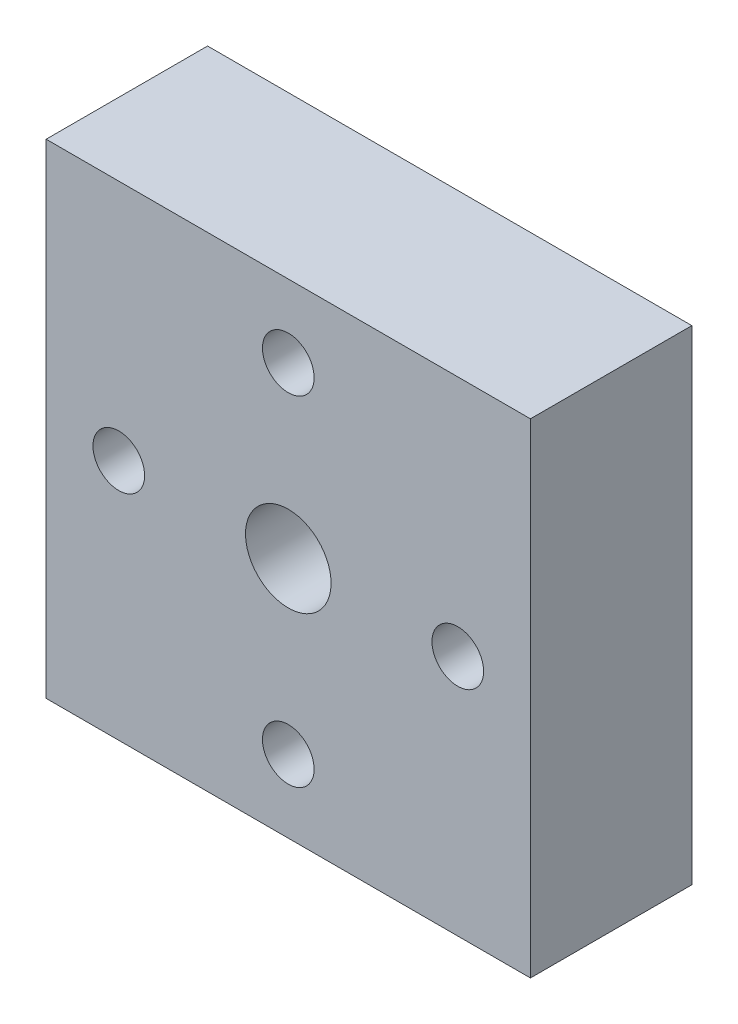
ISO-10303-21;
HEADER;
FILE_DESCRIPTION(('STEP AP214'),'2;1');
FILE_NAME('part.step','',(''),(''),'','','');
FILE_SCHEMA(('AUTOMOTIVE_DESIGN { 1 0 10303 214 1 1 1 1 }'));
ENDSEC;
DATA;
#1=APPLICATION_CONTEXT('core data for automotive mechanical design processes');
#2=APPLICATION_PROTOCOL_DEFINITION('international standard','automotive_design',2000,#1);
#3=PRODUCT_CONTEXT('',#1,'mechanical');
#4=PRODUCT('Part','Part','',(#3));
#5=PRODUCT_RELATED_PRODUCT_CATEGORY('part','',(#4));
#6=PRODUCT_DEFINITION_FORMATION('','',#4);
#7=PRODUCT_DEFINITION_CONTEXT('part definition',#1,'design');
#8=PRODUCT_DEFINITION('design','',#6,#7);
#9=PRODUCT_DEFINITION_SHAPE('','',#8);
#10=(LENGTH_UNIT() NAMED_UNIT(*) SI_UNIT(.MILLI.,.METRE.));
#11=(NAMED_UNIT(*) PLANE_ANGLE_UNIT() SI_UNIT($,.RADIAN.));
#12=(NAMED_UNIT(*) SI_UNIT($,.STERADIAN.) SOLID_ANGLE_UNIT());
#13=UNCERTAINTY_MEASURE_WITH_UNIT(LENGTH_MEASURE(1.E-05),#10,'distance_accuracy_value','');
#14=(GEOMETRIC_REPRESENTATION_CONTEXT(3) GLOBAL_UNCERTAINTY_ASSIGNED_CONTEXT((#13)) GLOBAL_UNIT_ASSIGNED_CONTEXT((#10,
#11,#12)) REPRESENTATION_CONTEXT('',''));
#15=CARTESIAN_POINT('',(0.,0.,0.));
#16=DIRECTION('',(0.,0.,1.));
#17=DIRECTION('',(1.,0.,0.));
#18=AXIS2_PLACEMENT_3D('',#15,#16,#17);
#19=CARTESIAN_POINT('',(30.,15.,-15.));
#20=DIRECTION('',(0.,0.,1.));
#21=DIRECTION('',(0.,-1.,0.));
#22=AXIS2_PLACEMENT_3D('',#19,#20,#21);
#23=PLANE('',#22);
#24=CARTESIAN_POINT('',(15.,10.5,-15.));
#25=DIRECTION('',(0.,0.,-1.));
#26=DIRECTION('',(0.,1.,0.));
#27=AXIS2_PLACEMENT_3D('',#24,#25,#26);
#28=CIRCLE('',#27,3.);
#29=CARTESIAN_POINT('',(15.,13.5,-15.));
#30=VERTEX_POINT('',#29);
#31=EDGE_CURVE('E237',#30,#30,#28,.T.);
#32=ORIENTED_EDGE('',*,*,#31,.F.);
#33=EDGE_LOOP('',(#32));
#34=FACE_BOUND('',#33,.T.);
#35=CARTESIAN_POINT('',(15.,-10.5,-15.));
#36=DIRECTION('',(0.,0.,-1.));
#37=DIRECTION('',(0.,1.,0.));
#38=AXIS2_PLACEMENT_3D('',#35,#36,#37);
#39=CIRCLE('',#38,3.);
#40=CARTESIAN_POINT('',(15.,-7.5,-15.));
#41=VERTEX_POINT('',#40);
#42=EDGE_CURVE('E233',#41,#41,#39,.T.);
#43=ORIENTED_EDGE('',*,*,#42,.F.);
#44=EDGE_LOOP('',(#43));
#45=FACE_BOUND('',#44,.T.);
#46=CARTESIAN_POINT('',(25.5,0.,-15.));
#47=DIRECTION('',(0.,0.,-1.));
#48=DIRECTION('',(0.,1.,0.));
#49=AXIS2_PLACEMENT_3D('',#46,#47,#48);
#50=CIRCLE('',#49,2.99999999999999);
#51=CARTESIAN_POINT('',(25.5,3.,-15.));
#52=VERTEX_POINT('',#51);
#53=EDGE_CURVE('E225',#52,#52,#50,.T.);
#54=ORIENTED_EDGE('',*,*,#53,.F.);
#55=EDGE_LOOP('',(#54));
#56=FACE_BOUND('',#55,.T.);
#57=CARTESIAN_POINT('',(4.5,0.,-15.));
#58=DIRECTION('',(0.,0.,-1.));
#59=DIRECTION('',(0.,1.,0.));
#60=AXIS2_PLACEMENT_3D('',#57,#58,#59);
#61=CIRCLE('',#60,3.);
#62=CARTESIAN_POINT('',(4.5,3.,-15.));
#63=VERTEX_POINT('',#62);
#64=EDGE_CURVE('E216',#63,#63,#61,.T.);
#65=ORIENTED_EDGE('',*,*,#64,.F.);
#66=EDGE_LOOP('',(#65));
#67=FACE_BOUND('',#66,.T.);
#68=CARTESIAN_POINT('',(15.,0.,-15.));
#69=DIRECTION('',(0.,0.,-1.));
#70=DIRECTION('',(0.,1.,0.));
#71=AXIS2_PLACEMENT_3D('',#68,#69,#70);
#72=CIRCLE('',#71,3.2);
#73=CARTESIAN_POINT('',(15.,3.2,-15.));
#74=VERTEX_POINT('',#73);
#75=EDGE_CURVE('E133',#74,#74,#72,.T.);
#76=ORIENTED_EDGE('',*,*,#75,.F.);
#77=EDGE_LOOP('',(#76));
#78=FACE_BOUND('',#77,.T.);
#79=CARTESIAN_POINT('',(6.16,-8.84,-15.));
#80=DIRECTION('',(0.,0.,1.));
#81=DIRECTION('',(0.,-1.,0.));
#82=AXIS2_PLACEMENT_3D('',#79,#80,#81);
#83=CIRCLE('',#82,1.95);
#84=CARTESIAN_POINT('',(6.16,-10.79,-15.));
#85=VERTEX_POINT('',#84);
#86=EDGE_CURVE('E11',#85,#85,#83,.F.);
#87=ORIENTED_EDGE('',*,*,#86,.F.);
#88=EDGE_LOOP('',(#87));
#89=FACE_BOUND('',#88,.T.);
#90=CARTESIAN_POINT('',(23.84,-8.84,-15.));
#91=DIRECTION('',(0.,0.,1.));
#92=DIRECTION('',(0.,-1.,0.));
#93=AXIS2_PLACEMENT_3D('',#90,#91,#92);
#94=CIRCLE('',#93,1.95);
#95=CARTESIAN_POINT('',(23.84,-10.79,-15.));
#96=VERTEX_POINT('',#95);
#97=EDGE_CURVE('E52',#96,#96,#94,.F.);
#98=ORIENTED_EDGE('',*,*,#97,.F.);
#99=EDGE_LOOP('',(#98));
#100=FACE_BOUND('',#99,.T.);
#101=CARTESIAN_POINT('',(23.84,8.84,-15.));
#102=DIRECTION('',(0.,0.,1.));
#103=DIRECTION('',(0.,-1.,0.));
#104=AXIS2_PLACEMENT_3D('',#101,#102,#103);
#105=CIRCLE('',#104,1.95);
#106=CARTESIAN_POINT('',(23.84,6.89,-15.));
#107=VERTEX_POINT('',#106);
#108=EDGE_CURVE('E124',#107,#107,#105,.F.);
#109=ORIENTED_EDGE('',*,*,#108,.F.);
#110=EDGE_LOOP('',(#109));
#111=FACE_BOUND('',#110,.T.);
#112=CARTESIAN_POINT('',(6.16,8.84,-15.));
#113=DIRECTION('',(0.,0.,1.));
#114=DIRECTION('',(0.,-1.,0.));
#115=AXIS2_PLACEMENT_3D('',#112,#113,#114);
#116=CIRCLE('',#115,1.95);
#117=CARTESIAN_POINT('',(6.16,6.89,-15.));
#118=VERTEX_POINT('',#117);
#119=EDGE_CURVE('E120',#118,#118,#116,.F.);
#120=ORIENTED_EDGE('',*,*,#119,.F.);
#121=EDGE_LOOP('',(#120));
#122=FACE_BOUND('',#121,.T.);
#123=CARTESIAN_POINT('',(15.,6.00010191410672,-15.));
#124=DIRECTION('',(0.,0.,-1.));
#125=DIRECTION('',(0.,1.,0.));
#126=AXIS2_PLACEMENT_3D('',#123,#124,#125);
#127=CIRCLE('',#126,0.649999999999999);
#128=CARTESIAN_POINT('',(15.,6.65010191410671,-15.));
#129=VERTEX_POINT('',#128);
#130=EDGE_CURVE('E113',#129,#129,#127,.T.);
#131=ORIENTED_EDGE('',*,*,#130,.F.);
#132=EDGE_LOOP('',(#131));
#133=FACE_BOUND('',#132,.T.);
#134=CARTESIAN_POINT('',(21.0010031212094,0.00299776167001203,-15.));
#135=DIRECTION('',(0.,0.,-1.));
#136=DIRECTION('',(0.,1.,0.));
#137=AXIS2_PLACEMENT_3D('',#134,#135,#136);
#138=CIRCLE('',#137,0.650000000000001);
#139=CARTESIAN_POINT('',(21.0010031212094,0.652997761670013,-15.));
#140=VERTEX_POINT('',#139);
#141=EDGE_CURVE('E170',#140,#140,#138,.T.);
#142=ORIENTED_EDGE('',*,*,#141,.F.);
#143=EDGE_LOOP('',(#142));
#144=FACE_BOUND('',#143,.T.);
#145=CARTESIAN_POINT('',(8.99732425437229,0.00299776167001116,-15.));
#146=DIRECTION('',(0.,0.,-1.));
#147=DIRECTION('',(0.,1.,0.));
#148=AXIS2_PLACEMENT_3D('',#145,#146,#147);
#149=CIRCLE('',#148,0.649999999999999);
#150=CARTESIAN_POINT('',(8.99732425437229,0.65299776167001,-15.));
#151=VERTEX_POINT('',#150);
#152=EDGE_CURVE('E178',#151,#151,#149,.T.);
#153=ORIENTED_EDGE('',*,*,#152,.F.);
#154=EDGE_LOOP('',(#153));
#155=FACE_BOUND('',#154,.T.);
#156=CARTESIAN_POINT('',(15.,-6.00010191410671,-15.));
#157=DIRECTION('',(0.,0.,-1.));
#158=DIRECTION('',(0.,1.,0.));
#159=AXIS2_PLACEMENT_3D('',#156,#157,#158);
#160=CIRCLE('',#159,0.649999999999999);
#161=CARTESIAN_POINT('',(15.,-5.35010191410672,-15.));
#162=VERTEX_POINT('',#161);
#163=EDGE_CURVE('E186',#162,#162,#160,.T.);
#164=ORIENTED_EDGE('',*,*,#163,.F.);
#165=EDGE_LOOP('',(#164));
#166=FACE_BOUND('',#165,.T.);
#167=DIRECTION('',(0.,1.,0.));
#168=VECTOR('',#167,1.);
#169=CARTESIAN_POINT('',(0.,15.,-15.));
#170=LINE('',#169,#168);
#171=CARTESIAN_POINT('',(0.,-15.,-15.));
#172=VERTEX_POINT('',#171);
#173=CARTESIAN_POINT('',(0.,15.,-15.));
#174=VERTEX_POINT('',#173);
#175=EDGE_CURVE('E99',#172,#174,#170,.T.);
#176=ORIENTED_EDGE('',*,*,#175,.T.);
#177=DIRECTION('',(-1.,0.,0.));
#178=VECTOR('',#177,1.);
#179=CARTESIAN_POINT('',(30.,15.,-15.));
#180=LINE('',#179,#178);
#181=CARTESIAN_POINT('',(30.,15.,-15.));
#182=VERTEX_POINT('',#181);
#183=EDGE_CURVE('E101',#182,#174,#180,.T.);
#184=ORIENTED_EDGE('',*,*,#183,.F.);
#185=DIRECTION('',(0.,1.,0.));
#186=VECTOR('',#185,1.);
#187=CARTESIAN_POINT('',(30.,15.,-15.));
#188=LINE('',#187,#186);
#189=CARTESIAN_POINT('',(30.,-15.,-15.));
#190=VERTEX_POINT('',#189);
#191=EDGE_CURVE('E93',#190,#182,#188,.T.);
#192=ORIENTED_EDGE('',*,*,#191,.F.);
#193=DIRECTION('',(-1.,0.,0.));
#194=VECTOR('',#193,1.);
#195=CARTESIAN_POINT('',(30.,-15.,-15.));
#196=LINE('',#195,#194);
#197=EDGE_CURVE('E86',#190,#172,#196,.T.);
#198=ORIENTED_EDGE('',*,*,#197,.T.);
#199=EDGE_LOOP('',(#176,#184,#192,#198));
#200=FACE_BOUND('',#199,.T.);
#201=ADVANCED_FACE('F43',(#34,#45,#56,#67,#78,#89,#100,#111,#122,#133,#144,#155,#166,#200),#23,.F.);
#202=CARTESIAN_POINT('',(30.,15.,15.));
#203=DIRECTION('',(0.,-1.,0.));
#204=DIRECTION('',(0.,0.,-1.));
#205=AXIS2_PLACEMENT_3D('',#202,#203,#204);
#206=PLANE('',#205);
#207=DIRECTION('',(0.,0.,1.));
#208=VECTOR('',#207,1.);
#209=CARTESIAN_POINT('',(0.,15.,15.));
#210=LINE('',#209,#208);
#211=CARTESIAN_POINT('',(0.,15.,-5.));
#212=VERTEX_POINT('',#211);
#213=EDGE_CURVE('E94',#174,#212,#210,.T.);
#214=ORIENTED_EDGE('',*,*,#213,.T.);
#215=DIRECTION('',(1.,0.,0.));
#216=VECTOR('',#215,1.);
#217=CARTESIAN_POINT('',(0.,15.,-5.));
#218=LINE('',#217,#216);
#219=CARTESIAN_POINT('',(30.,15.,-5.));
#220=VERTEX_POINT('',#219);
#221=EDGE_CURVE('E60',#212,#220,#218,.T.);
#222=ORIENTED_EDGE('',*,*,#221,.T.);
#223=DIRECTION('',(0.,0.,1.));
#224=VECTOR('',#223,1.);
#225=CARTESIAN_POINT('',(30.,15.,15.));
#226=LINE('',#225,#224);
#227=EDGE_CURVE('E194',#182,#220,#226,.T.);
#228=ORIENTED_EDGE('',*,*,#227,.F.);
#229=ORIENTED_EDGE('',*,*,#183,.T.);
#230=EDGE_LOOP('',(#214,#222,#228,#229));
#231=FACE_BOUND('',#230,.T.);
#232=ADVANCED_FACE('F204',(#231),#206,.F.);
#233=CARTESIAN_POINT('',(30.,-15.,15.));
#234=DIRECTION('',(0.,1.,0.));
#235=DIRECTION('',(0.,0.,1.));
#236=AXIS2_PLACEMENT_3D('',#233,#234,#235);
#237=PLANE('',#236);
#238=DIRECTION('',(0.,0.,-1.));
#239=VECTOR('',#238,1.);
#240=CARTESIAN_POINT('',(30.,-15.,15.));
#241=LINE('',#240,#239);
#242=CARTESIAN_POINT('',(30.,-15.,-5.00000000000001));
#243=VERTEX_POINT('',#242);
#244=EDGE_CURVE('E69',#243,#190,#241,.T.);
#245=ORIENTED_EDGE('',*,*,#244,.F.);
#246=DIRECTION('',(-1.,0.,0.));
#247=VECTOR('',#246,1.);
#248=CARTESIAN_POINT('',(30.,-15.,-5.));
#249=LINE('',#248,#247);
#250=CARTESIAN_POINT('',(0.,-15.,-5.00000000000001));
#251=VERTEX_POINT('',#250);
#252=EDGE_CURVE('E89',#243,#251,#249,.T.);
#253=ORIENTED_EDGE('',*,*,#252,.T.);
#254=DIRECTION('',(0.,0.,-1.));
#255=VECTOR('',#254,1.);
#256=CARTESIAN_POINT('',(0.,-15.,15.));
#257=LINE('',#256,#255);
#258=EDGE_CURVE('E83',#251,#172,#257,.T.);
#259=ORIENTED_EDGE('',*,*,#258,.T.);
#260=ORIENTED_EDGE('',*,*,#197,.F.);
#261=EDGE_LOOP('',(#245,#253,#259,#260));
#262=FACE_BOUND('',#261,.T.);
#263=ADVANCED_FACE('F85',(#262),#237,.F.);
#264=CARTESIAN_POINT('',(30.,0.,0.));
#265=DIRECTION('',(1.,0.,0.));
#266=DIRECTION('',(0.,0.,-1.));
#267=AXIS2_PLACEMENT_3D('',#264,#265,#266);
#268=PLANE('',#267);
#269=DIRECTION('',(0.,1.,0.));
#270=VECTOR('',#269,1.);
#271=CARTESIAN_POINT('',(30.,15.,-5.));
#272=LINE('',#271,#270);
#273=EDGE_CURVE('E201',#243,#220,#272,.T.);
#274=ORIENTED_EDGE('',*,*,#273,.F.);
#275=ORIENTED_EDGE('',*,*,#244,.T.);
#276=ORIENTED_EDGE('',*,*,#191,.T.);
#277=ORIENTED_EDGE('',*,*,#227,.T.);
#278=EDGE_LOOP('',(#274,#275,#276,#277));
#279=FACE_BOUND('',#278,.T.);
#280=ADVANCED_FACE('F199',(#279),#268,.T.);
#281=CARTESIAN_POINT('',(0.,0.,0.));
#282=DIRECTION('',(1.,0.,0.));
#283=DIRECTION('',(0.,0.,-1.));
#284=AXIS2_PLACEMENT_3D('',#281,#282,#283);
#285=PLANE('',#284);
#286=ORIENTED_EDGE('',*,*,#258,.F.);
#287=DIRECTION('',(0.,1.,0.));
#288=VECTOR('',#287,1.);
#289=CARTESIAN_POINT('',(0.,15.,-5.));
#290=LINE('',#289,#288);
#291=EDGE_CURVE('E206',#251,#212,#290,.T.);
#292=ORIENTED_EDGE('',*,*,#291,.T.);
#293=ORIENTED_EDGE('',*,*,#213,.F.);
#294=ORIENTED_EDGE('',*,*,#175,.F.);
#295=EDGE_LOOP('',(#286,#292,#293,#294));
#296=FACE_BOUND('',#295,.T.);
#297=ADVANCED_FACE('F103',(#296),#285,.F.);
#298=CARTESIAN_POINT('',(15.,-6.00010191410671,-8.));
#299=DIRECTION('',(0.,0.,-1.));
#300=DIRECTION('',(0.,1.,0.));
#301=AXIS2_PLACEMENT_3D('',#298,#299,#300);
#302=CYLINDRICAL_SURFACE('',#301,0.649999999999999);
#303=CARTESIAN_POINT('',(15.,-6.00010191410671,-8.));
#304=DIRECTION('',(0.,0.,-1.));
#305=DIRECTION('',(0.,1.,0.));
#306=AXIS2_PLACEMENT_3D('',#303,#304,#305);
#307=CIRCLE('',#306,0.649999999999999);
#308=CARTESIAN_POINT('',(15.,-5.35010191410672,-8.));
#309=VERTEX_POINT('',#308);
#310=EDGE_CURVE('E165',#309,#309,#307,.T.);
#311=ORIENTED_EDGE('',*,*,#310,.F.);
#312=EDGE_LOOP('',(#311));
#313=FACE_BOUND('',#312,.T.);
#314=ORIENTED_EDGE('',*,*,#163,.T.);
#315=EDGE_LOOP('',(#314));
#316=FACE_BOUND('',#315,.T.);
#317=ADVANCED_FACE('F320',(#313,#316),#302,.F.);
#318=CARTESIAN_POINT('',(15.,-6.00010191410671,-8.));
#319=DIRECTION('',(0.,0.,-1.));
#320=DIRECTION('',(0.,1.,0.));
#321=AXIS2_PLACEMENT_3D('',#318,#319,#320);
#322=PLANE('',#321);
#323=ORIENTED_EDGE('',*,*,#310,.T.);
#324=EDGE_LOOP('',(#323));
#325=FACE_BOUND('',#324,.T.);
#326=ADVANCED_FACE('F322',(#325),#322,.T.);
#327=CARTESIAN_POINT('',(8.99732425437229,0.00299776167001027,-8.));
#328=DIRECTION('',(0.,0.,-1.));
#329=DIRECTION('',(0.,1.,0.));
#330=AXIS2_PLACEMENT_3D('',#327,#328,#329);
#331=CYLINDRICAL_SURFACE('',#330,0.649999999999999);
#332=CARTESIAN_POINT('',(8.99732425437229,0.00299776167001027,-8.));
#333=DIRECTION('',(0.,0.,-1.));
#334=DIRECTION('',(0.,1.,0.));
#335=AXIS2_PLACEMENT_3D('',#332,#333,#334);
#336=CIRCLE('',#335,0.649999999999999);
#337=CARTESIAN_POINT('',(8.99732425437229,0.652997761670009,-8.));
#338=VERTEX_POINT('',#337);
#339=EDGE_CURVE('E182',#338,#338,#336,.T.);
#340=ORIENTED_EDGE('',*,*,#339,.F.);
#341=EDGE_LOOP('',(#340));
#342=FACE_BOUND('',#341,.T.);
#343=ORIENTED_EDGE('',*,*,#152,.T.);
#344=EDGE_LOOP('',(#343));
#345=FACE_BOUND('',#344,.T.);
#346=ADVANCED_FACE('F329',(#342,#345),#331,.F.);
#347=CARTESIAN_POINT('',(8.99732425437229,0.00299776167001027,-8.));
#348=DIRECTION('',(0.,0.,-1.));
#349=DIRECTION('',(0.,1.,0.));
#350=AXIS2_PLACEMENT_3D('',#347,#348,#349);
#351=PLANE('',#350);
#352=ORIENTED_EDGE('',*,*,#339,.T.);
#353=EDGE_LOOP('',(#352));
#354=FACE_BOUND('',#353,.T.);
#355=ADVANCED_FACE('F335',(#354),#351,.T.);
#356=CARTESIAN_POINT('',(21.0010031212094,0.00299776167001114,-8.));
#357=DIRECTION('',(0.,0.,-1.));
#358=DIRECTION('',(0.,1.,0.));
#359=AXIS2_PLACEMENT_3D('',#356,#357,#358);
#360=CYLINDRICAL_SURFACE('',#359,0.650000000000001);
#361=CARTESIAN_POINT('',(21.0010031212094,0.00299776167001114,-8.));
#362=DIRECTION('',(0.,0.,-1.));
#363=DIRECTION('',(0.,1.,0.));
#364=AXIS2_PLACEMENT_3D('',#361,#362,#363);
#365=CIRCLE('',#364,0.650000000000001);
#366=CARTESIAN_POINT('',(21.0010031212094,0.652997761670012,-8.));
#367=VERTEX_POINT('',#366);
#368=EDGE_CURVE('E174',#367,#367,#365,.T.);
#369=ORIENTED_EDGE('',*,*,#368,.F.);
#370=EDGE_LOOP('',(#369));
#371=FACE_BOUND('',#370,.T.);
#372=ORIENTED_EDGE('',*,*,#141,.T.);
#373=EDGE_LOOP('',(#372));
#374=FACE_BOUND('',#373,.T.);
#375=ADVANCED_FACE('F647',(#371,#374),#360,.F.);
#376=CARTESIAN_POINT('',(21.0010031212094,0.00299776167001114,-8.));
#377=DIRECTION('',(0.,0.,-1.));
#378=DIRECTION('',(0.,1.,0.));
#379=AXIS2_PLACEMENT_3D('',#376,#377,#378);
#380=PLANE('',#379);
#381=ORIENTED_EDGE('',*,*,#368,.T.);
#382=EDGE_LOOP('',(#381));
#383=FACE_BOUND('',#382,.T.);
#384=ADVANCED_FACE('F637',(#383),#380,.T.);
#385=CARTESIAN_POINT('',(15.,6.00010191410671,-8.));
#386=DIRECTION('',(0.,0.,-1.));
#387=DIRECTION('',(0.,1.,0.));
#388=AXIS2_PLACEMENT_3D('',#385,#386,#387);
#389=CYLINDRICAL_SURFACE('',#388,0.649999999999999);
#390=CARTESIAN_POINT('',(15.,6.00010191410671,-8.));
#391=DIRECTION('',(0.,0.,-1.));
#392=DIRECTION('',(0.,1.,0.));
#393=AXIS2_PLACEMENT_3D('',#390,#391,#392);
#394=CIRCLE('',#393,0.649999999999999);
#395=CARTESIAN_POINT('',(15.,6.65010191410671,-8.));
#396=VERTEX_POINT('',#395);
#397=EDGE_CURVE('E107',#396,#396,#394,.T.);
#398=ORIENTED_EDGE('',*,*,#397,.F.);
#399=EDGE_LOOP('',(#398));
#400=FACE_BOUND('',#399,.T.);
#401=ORIENTED_EDGE('',*,*,#130,.T.);
#402=EDGE_LOOP('',(#401));
#403=FACE_BOUND('',#402,.T.);
#404=ADVANCED_FACE('F627',(#400,#403),#389,.F.);
#405=CARTESIAN_POINT('',(15.,6.00010191410671,-8.));
#406=DIRECTION('',(0.,0.,-1.));
#407=DIRECTION('',(0.,1.,0.));
#408=AXIS2_PLACEMENT_3D('',#405,#406,#407);
#409=PLANE('',#408);
#410=ORIENTED_EDGE('',*,*,#397,.T.);
#411=EDGE_LOOP('',(#410));
#412=FACE_BOUND('',#411,.T.);
#413=ADVANCED_FACE('F617',(#412),#409,.T.);
#414=CARTESIAN_POINT('',(6.16,8.84,-17.));
#415=DIRECTION('',(0.,0.,1.));
#416=DIRECTION('',(0.,-1.,0.));
#417=AXIS2_PLACEMENT_3D('',#414,#415,#416);
#418=CYLINDRICAL_SURFACE('',#417,1.95);
#419=CARTESIAN_POINT('',(6.16,8.84,-17.));
#420=DIRECTION('',(0.,0.,-1.));
#421=DIRECTION('',(0.,1.,0.));
#422=AXIS2_PLACEMENT_3D('',#419,#420,#421);
#423=CIRCLE('',#422,1.95);
#424=CARTESIAN_POINT('',(6.16,10.79,-17.));
#425=VERTEX_POINT('',#424);
#426=EDGE_CURVE('E162',#425,#425,#423,.T.);
#427=ORIENTED_EDGE('',*,*,#426,.F.);
#428=EDGE_LOOP('',(#427));
#429=FACE_BOUND('',#428,.T.);
#430=ORIENTED_EDGE('',*,*,#119,.T.);
#431=EDGE_LOOP('',(#430));
#432=FACE_BOUND('',#431,.T.);
#433=ADVANCED_FACE('F607',(#429,#432),#418,.T.);
#434=CARTESIAN_POINT('',(6.16,8.84,-17.));
#435=DIRECTION('',(0.,0.,-1.));
#436=DIRECTION('',(0.,1.,0.));
#437=AXIS2_PLACEMENT_3D('',#434,#435,#436);
#438=PLANE('',#437);
#439=ORIENTED_EDGE('',*,*,#426,.T.);
#440=EDGE_LOOP('',(#439));
#441=FACE_BOUND('',#440,.T.);
#442=ADVANCED_FACE('F597',(#441),#438,.T.);
#443=CARTESIAN_POINT('',(23.84,8.84,-17.));
#444=DIRECTION('',(0.,0.,1.));
#445=DIRECTION('',(0.,-1.,0.));
#446=AXIS2_PLACEMENT_3D('',#443,#444,#445);
#447=CYLINDRICAL_SURFACE('',#446,1.95);
#448=CARTESIAN_POINT('',(23.84,8.84,-17.));
#449=DIRECTION('',(0.,0.,-1.));
#450=DIRECTION('',(0.,1.,0.));
#451=AXIS2_PLACEMENT_3D('',#448,#449,#450);
#452=CIRCLE('',#451,1.95);
#453=CARTESIAN_POINT('',(23.84,10.79,-17.));
#454=VERTEX_POINT('',#453);
#455=EDGE_CURVE('E158',#454,#454,#452,.T.);
#456=ORIENTED_EDGE('',*,*,#455,.F.);
#457=EDGE_LOOP('',(#456));
#458=FACE_BOUND('',#457,.T.);
#459=ORIENTED_EDGE('',*,*,#108,.T.);
#460=EDGE_LOOP('',(#459));
#461=FACE_BOUND('',#460,.T.);
#462=ADVANCED_FACE('F587',(#458,#461),#447,.T.);
#463=CARTESIAN_POINT('',(23.84,8.84,-17.));
#464=DIRECTION('',(0.,0.,-1.));
#465=DIRECTION('',(0.,1.,0.));
#466=AXIS2_PLACEMENT_3D('',#463,#464,#465);
#467=PLANE('',#466);
#468=ORIENTED_EDGE('',*,*,#455,.T.);
#469=EDGE_LOOP('',(#468));
#470=FACE_BOUND('',#469,.T.);
#471=ADVANCED_FACE('F577',(#470),#467,.T.);
#472=CARTESIAN_POINT('',(23.84,-8.84,-17.));
#473=DIRECTION('',(0.,0.,1.));
#474=DIRECTION('',(0.,-1.,0.));
#475=AXIS2_PLACEMENT_3D('',#472,#473,#474);
#476=CYLINDRICAL_SURFACE('',#475,1.95);
#477=CARTESIAN_POINT('',(23.84,-8.84,-17.));
#478=DIRECTION('',(0.,0.,-1.));
#479=DIRECTION('',(0.,1.,0.));
#480=AXIS2_PLACEMENT_3D('',#477,#478,#479);
#481=CIRCLE('',#480,1.95);
#482=CARTESIAN_POINT('',(23.84,-6.89,-17.));
#483=VERTEX_POINT('',#482);
#484=EDGE_CURVE('E154',#483,#483,#481,.T.);
#485=ORIENTED_EDGE('',*,*,#484,.F.);
#486=EDGE_LOOP('',(#485));
#487=FACE_BOUND('',#486,.T.);
#488=ORIENTED_EDGE('',*,*,#97,.T.);
#489=EDGE_LOOP('',(#488));
#490=FACE_BOUND('',#489,.T.);
#491=ADVANCED_FACE('F567',(#487,#490),#476,.T.);
#492=CARTESIAN_POINT('',(23.84,-8.84,-17.));
#493=DIRECTION('',(0.,0.,-1.));
#494=DIRECTION('',(0.,1.,0.));
#495=AXIS2_PLACEMENT_3D('',#492,#493,#494);
#496=PLANE('',#495);
#497=ORIENTED_EDGE('',*,*,#484,.T.);
#498=EDGE_LOOP('',(#497));
#499=FACE_BOUND('',#498,.T.);
#500=ADVANCED_FACE('F557',(#499),#496,.T.);
#501=CARTESIAN_POINT('',(6.16,-8.84,-17.));
#502=DIRECTION('',(0.,0.,1.));
#503=DIRECTION('',(0.,-1.,0.));
#504=AXIS2_PLACEMENT_3D('',#501,#502,#503);
#505=CYLINDRICAL_SURFACE('',#504,1.95);
#506=CARTESIAN_POINT('',(6.16,-8.84,-17.));
#507=DIRECTION('',(0.,0.,-1.));
#508=DIRECTION('',(0.,1.,0.));
#509=AXIS2_PLACEMENT_3D('',#506,#507,#508);
#510=CIRCLE('',#509,1.95);
#511=CARTESIAN_POINT('',(6.16,-6.89,-17.));
#512=VERTEX_POINT('',#511);
#513=EDGE_CURVE('E149',#512,#512,#510,.T.);
#514=ORIENTED_EDGE('',*,*,#513,.F.);
#515=EDGE_LOOP('',(#514));
#516=FACE_BOUND('',#515,.T.);
#517=ORIENTED_EDGE('',*,*,#86,.T.);
#518=EDGE_LOOP('',(#517));
#519=FACE_BOUND('',#518,.T.);
#520=ADVANCED_FACE('F547',(#516,#519),#505,.T.);
#521=CARTESIAN_POINT('',(6.16,-8.84,-17.));
#522=DIRECTION('',(0.,0.,-1.));
#523=DIRECTION('',(0.,1.,0.));
#524=AXIS2_PLACEMENT_3D('',#521,#522,#523);
#525=PLANE('',#524);
#526=ORIENTED_EDGE('',*,*,#513,.T.);
#527=EDGE_LOOP('',(#526));
#528=FACE_BOUND('',#527,.T.);
#529=ADVANCED_FACE('F537',(#528),#525,.T.);
#530=CARTESIAN_POINT('',(15.,0.,-14.));
#531=DIRECTION('',(0.,0.,-1.));
#532=DIRECTION('',(0.,1.,0.));
#533=AXIS2_PLACEMENT_3D('',#530,#531,#532);
#534=CYLINDRICAL_SURFACE('',#533,3.2);
#535=CARTESIAN_POINT('',(15.,0.,-14.));
#536=DIRECTION('',(0.,0.,-1.));
#537=DIRECTION('',(0.,1.,0.));
#538=AXIS2_PLACEMENT_3D('',#535,#536,#537);
#539=CIRCLE('',#538,3.2);
#540=CARTESIAN_POINT('',(15.,3.2,-14.));
#541=VERTEX_POINT('',#540);
#542=EDGE_CURVE('E139',#541,#541,#539,.T.);
#543=ORIENTED_EDGE('',*,*,#542,.F.);
#544=EDGE_LOOP('',(#543));
#545=FACE_BOUND('',#544,.T.);
#546=ORIENTED_EDGE('',*,*,#75,.T.);
#547=EDGE_LOOP('',(#546));
#548=FACE_BOUND('',#547,.T.);
#549=ADVANCED_FACE('F528',(#545,#548),#534,.F.);
#550=CARTESIAN_POINT('',(15.,0.,-14.));
#551=DIRECTION('',(0.,0.,-1.));
#552=DIRECTION('',(0.,1.,0.));
#553=AXIS2_PLACEMENT_3D('',#550,#551,#552);
#554=PLANE('',#553);
#555=CARTESIAN_POINT('',(15.,0.,-14.));
#556=DIRECTION('',(0.,0.,-1.));
#557=DIRECTION('',(0.,1.,0.));
#558=AXIS2_PLACEMENT_3D('',#555,#556,#557);
#559=CIRCLE('',#558,2.65);
#560=CARTESIAN_POINT('',(15.,2.65,-14.));
#561=VERTEX_POINT('',#560);
#562=EDGE_CURVE('E130',#561,#561,#559,.T.);
#563=ORIENTED_EDGE('',*,*,#562,.F.);
#564=EDGE_LOOP('',(#563));
#565=FACE_BOUND('',#564,.T.);
#566=ORIENTED_EDGE('',*,*,#542,.T.);
#567=EDGE_LOOP('',(#566));
#568=FACE_BOUND('',#567,.T.);
#569=ADVANCED_FACE('F370',(#565,#568),#554,.T.);
#570=CARTESIAN_POINT('',(15.,0.,15.));
#571=DIRECTION('',(0.,0.,-1.));
#572=DIRECTION('',(0.,1.,0.));
#573=AXIS2_PLACEMENT_3D('',#570,#571,#572);
#574=CYLINDRICAL_SURFACE('',#573,2.65);
#575=CARTESIAN_POINT('',(15.,0.,-5.));
#576=DIRECTION('',(0.,0.,-1.));
#577=DIRECTION('',(0.,1.,0.));
#578=AXIS2_PLACEMENT_3D('',#575,#576,#577);
#579=CIRCLE('',#578,2.65);
#580=CARTESIAN_POINT('',(15.,2.65,-5.));
#581=VERTEX_POINT('',#580);
#582=EDGE_CURVE('E46',#581,#581,#579,.F.);
#583=CARTESIAN_POINT('',(15.,2.65,-5.));
#584=CARTESIAN_POINT('',(15.,2.65,-5.09375));
#585=CARTESIAN_POINT('',(15.,2.65,-5.1875));
#586=CARTESIAN_POINT('',(15.,2.65,-5.375));
#587=CARTESIAN_POINT('',(15.,2.65,-5.46875));
#588=CARTESIAN_POINT('',(15.,2.65,-5.65625));
#589=CARTESIAN_POINT('',(15.,2.65,-5.75));
#590=CARTESIAN_POINT('',(15.,2.65,-5.9375));
#591=CARTESIAN_POINT('',(15.,2.65,-6.03125));
#592=CARTESIAN_POINT('',(15.,2.65,-6.21875));
#593=CARTESIAN_POINT('',(15.,2.65,-6.3125));
#594=CARTESIAN_POINT('',(15.,2.65,-6.5));
#595=CARTESIAN_POINT('',(15.,2.65,-6.59375));
#596=CARTESIAN_POINT('',(15.,2.65,-6.78125));
#597=CARTESIAN_POINT('',(15.,2.65,-6.875));
#598=CARTESIAN_POINT('',(15.,2.65,-7.0625));
#599=CARTESIAN_POINT('',(15.,2.65,-7.15625));
#600=CARTESIAN_POINT('',(15.,2.65,-7.34375));
#601=CARTESIAN_POINT('',(15.,2.65,-7.4375));
#602=CARTESIAN_POINT('',(15.,2.65,-7.625));
#603=CARTESIAN_POINT('',(15.,2.65,-7.71875));
#604=CARTESIAN_POINT('',(15.,2.65,-7.90625));
#605=CARTESIAN_POINT('',(15.,2.65,-8.));
#606=CARTESIAN_POINT('',(15.,2.65,-8.1875));
#607=CARTESIAN_POINT('',(15.,2.65,-8.28125));
#608=CARTESIAN_POINT('',(15.,2.65,-8.46875));
#609=CARTESIAN_POINT('',(15.,2.65,-8.5625));
#610=CARTESIAN_POINT('',(15.,2.65,-8.75));
#611=CARTESIAN_POINT('',(15.,2.65,-8.84375));
#612=CARTESIAN_POINT('',(15.,2.65,-9.03125));
#613=CARTESIAN_POINT('',(15.,2.65,-9.125));
#614=CARTESIAN_POINT('',(15.,2.65,-9.3125));
#615=CARTESIAN_POINT('',(15.,2.65,-9.40625));
#616=CARTESIAN_POINT('',(15.,2.65,-9.59375));
#617=CARTESIAN_POINT('',(15.,2.65,-9.6875));
#618=CARTESIAN_POINT('',(15.,2.65,-9.875));
#619=CARTESIAN_POINT('',(15.,2.65,-9.96875));
#620=CARTESIAN_POINT('',(15.,2.65,-10.15625));
#621=CARTESIAN_POINT('',(15.,2.65,-10.25));
#622=CARTESIAN_POINT('',(15.,2.65,-10.4375));
#623=CARTESIAN_POINT('',(15.,2.65,-10.53125));
#624=CARTESIAN_POINT('',(15.,2.65,-10.71875));
#625=CARTESIAN_POINT('',(15.,2.65,-10.8125));
#626=CARTESIAN_POINT('',(15.,2.65,-11.));
#627=CARTESIAN_POINT('',(15.,2.65,-11.09375));
#628=CARTESIAN_POINT('',(15.,2.65,-11.28125));
#629=CARTESIAN_POINT('',(15.,2.65,-11.375));
#630=CARTESIAN_POINT('',(15.,2.65,-11.5625));
#631=CARTESIAN_POINT('',(15.,2.65,-11.65625));
#632=CARTESIAN_POINT('',(15.,2.65,-11.84375));
#633=CARTESIAN_POINT('',(15.,2.65,-11.9375));
#634=CARTESIAN_POINT('',(15.,2.65,-12.125));
#635=CARTESIAN_POINT('',(15.,2.65,-12.21875));
#636=CARTESIAN_POINT('',(15.,2.65,-12.40625));
#637=CARTESIAN_POINT('',(15.,2.65,-12.5));
#638=CARTESIAN_POINT('',(15.,2.65,-12.6875));
#639=CARTESIAN_POINT('',(15.,2.65,-12.78125));
#640=CARTESIAN_POINT('',(15.,2.65,-12.96875));
#641=CARTESIAN_POINT('',(15.,2.65,-13.0625));
#642=CARTESIAN_POINT('',(15.,2.65,-13.25));
#643=CARTESIAN_POINT('',(15.,2.65,-13.34375));
#644=CARTESIAN_POINT('',(15.,2.65,-13.53125));
#645=CARTESIAN_POINT('',(15.,2.65,-13.625));
#646=CARTESIAN_POINT('',(15.,2.65,-13.8125));
#647=CARTESIAN_POINT('',(15.,2.65,-13.90625));
#648=CARTESIAN_POINT('',(15.,2.65,-14.));
#649=B_SPLINE_CURVE_WITH_KNOTS('',3,(#583,#584,#585,#586,#587,#588,#589,#590,#591,#592,#593,
#594,#595,#596,#597,#598,#599,#600,#601,#602,#603,#604,#605,#606,#607,#608,#609,#610,#611,#612,
#613,#614,#615,#616,#617,#618,#619,#620,#621,#622,#623,#624,#625,#626,#627,#628,#629,#630,#631,
#632,#633,#634,#635,#636,#637,#638,#639,#640,#641,#642,#643,#644,#645,#646,#647,#648),
.UNSPECIFIED.,.F.,.F.,(4,2,2,2,2,2,2,2,2,2,2,2,2,2,2,2,2,2,2,2,2,2,2,2,2,2,2,2,2,2,2,2,4),(0.,
0.28125,0.5625,0.843750000000001,1.125,1.40625,1.6875,1.96875,2.25,2.53125,2.8125,3.09375,3.375,
3.65625,3.9375,4.21875,4.5,4.78125,5.0625,5.34375,5.625,5.90625,6.1875,6.46875,6.75,7.03125,
7.3125,7.59375,7.875,8.15625,8.4375,8.71875,9.),.UNSPECIFIED.);
#650=EDGE_CURVE('BSEAM366',#581,#561,#649,.T.);
#651=ORIENTED_EDGE('',*,*,#582,.T.);
#652=ORIENTED_EDGE('',*,*,#562,.T.);
#653=ORIENTED_EDGE('',*,*,#650,.T.);
#654=ORIENTED_EDGE('',*,*,#650,.F.);
#655=EDGE_LOOP('',(#651,#653,#652,#654));
#656=FACE_BOUND('',#655,.T.);
#657=ADVANCED_FACE('F366',(#656),#574,.F.);
#658=CARTESIAN_POINT('',(0.,15.,-5.));
#659=DIRECTION('',(0.,0.,-1.));
#660=DIRECTION('',(0.,1.,0.));
#661=AXIS2_PLACEMENT_3D('',#658,#659,#660);
#662=PLANE('',#661);
#663=CARTESIAN_POINT('',(4.5,0.,-5.));
#664=DIRECTION('',(0.,0.,-1.));
#665=DIRECTION('',(0.,1.,0.));
#666=AXIS2_PLACEMENT_3D('',#663,#664,#665);
#667=CIRCLE('',#666,1.6);
#668=CARTESIAN_POINT('',(4.5,1.6,-5.));
#669=VERTEX_POINT('',#668);
#670=EDGE_CURVE('E217',#669,#669,#667,.T.);
#671=ORIENTED_EDGE('',*,*,#670,.T.);
#672=EDGE_LOOP('',(#671));
#673=FACE_BOUND('',#672,.T.);
#674=CARTESIAN_POINT('',(15.,-10.5,-5.));
#675=DIRECTION('',(0.,0.,-1.));
#676=DIRECTION('',(0.,1.,0.));
#677=AXIS2_PLACEMENT_3D('',#674,#675,#676);
#678=CIRCLE('',#677,1.6);
#679=CARTESIAN_POINT('',(15.,-8.9,-5.));
#680=VERTEX_POINT('',#679);
#681=EDGE_CURVE('E260',#680,#680,#678,.T.);
#682=ORIENTED_EDGE('',*,*,#681,.T.);
#683=EDGE_LOOP('',(#682));
#684=FACE_BOUND('',#683,.T.);
#685=CARTESIAN_POINT('',(15.,10.5,-5.));
#686=DIRECTION('',(0.,0.,-1.));
#687=DIRECTION('',(0.,1.,0.));
#688=AXIS2_PLACEMENT_3D('',#685,#686,#687);
#689=CIRCLE('',#688,1.6);
#690=CARTESIAN_POINT('',(15.,12.1,-5.));
#691=VERTEX_POINT('',#690);
#692=EDGE_CURVE('E252',#691,#691,#689,.T.);
#693=ORIENTED_EDGE('',*,*,#692,.T.);
#694=EDGE_LOOP('',(#693));
#695=FACE_BOUND('',#694,.T.);
#696=CARTESIAN_POINT('',(25.5,0.,-5.));
#697=DIRECTION('',(0.,0.,-1.));
#698=DIRECTION('',(0.,1.,0.));
#699=AXIS2_PLACEMENT_3D('',#696,#697,#698);
#700=CIRCLE('',#699,1.6);
#701=CARTESIAN_POINT('',(25.5,1.60000000000001,-5.));
#702=VERTEX_POINT('',#701);
#703=EDGE_CURVE('E244',#702,#702,#700,.T.);
#704=ORIENTED_EDGE('',*,*,#703,.T.);
#705=EDGE_LOOP('',(#704));
#706=FACE_BOUND('',#705,.T.);
#707=ORIENTED_EDGE('',*,*,#582,.F.);
#708=EDGE_LOOP('',(#707));
#709=FACE_BOUND('',#708,.T.);
#710=ORIENTED_EDGE('',*,*,#273,.T.);
#711=ORIENTED_EDGE('',*,*,#221,.F.);
#712=ORIENTED_EDGE('',*,*,#291,.F.);
#713=ORIENTED_EDGE('',*,*,#252,.F.);
#714=EDGE_LOOP('',(#710,#711,#712,#713));
#715=FACE_BOUND('',#714,.T.);
#716=ADVANCED_FACE('F276',(#673,#684,#695,#706,#709,#715),#662,.F.);
#717=CARTESIAN_POINT('',(4.5,0.,-10.));
#718=DIRECTION('',(0.,0.,-1.));
#719=DIRECTION('',(0.,1.,0.));
#720=AXIS2_PLACEMENT_3D('',#717,#718,#719);
#721=CYLINDRICAL_SURFACE('',#720,3.);
#722=CARTESIAN_POINT('',(4.5,0.,-10.));
#723=DIRECTION('',(0.,0.,-1.));
#724=DIRECTION('',(0.,1.,0.));
#725=AXIS2_PLACEMENT_3D('',#722,#723,#724);
#726=CIRCLE('',#725,3.);
#727=CARTESIAN_POINT('',(4.5,3.,-10.));
#728=VERTEX_POINT('',#727);
#729=EDGE_CURVE('E212',#728,#728,#726,.T.);
#730=ORIENTED_EDGE('',*,*,#729,.F.);
#731=EDGE_LOOP('',(#730));
#732=FACE_BOUND('',#731,.T.);
#733=ORIENTED_EDGE('',*,*,#64,.T.);
#734=EDGE_LOOP('',(#733));
#735=FACE_BOUND('',#734,.T.);
#736=ADVANCED_FACE('F290',(#732,#735),#721,.F.);
#737=CARTESIAN_POINT('',(4.5,0.,-10.));
#738=DIRECTION('',(0.,0.,-1.));
#739=DIRECTION('',(0.,1.,0.));
#740=AXIS2_PLACEMENT_3D('',#737,#738,#739);
#741=PLANE('',#740);
#742=CARTESIAN_POINT('',(4.5,0.,-10.));
#743=DIRECTION('',(0.,0.,-1.));
#744=DIRECTION('',(0.,1.,0.));
#745=AXIS2_PLACEMENT_3D('',#742,#743,#744);
#746=CIRCLE('',#745,1.6);
#747=CARTESIAN_POINT('',(4.5,1.6,-10.));
#748=VERTEX_POINT('',#747);
#749=EDGE_CURVE('E268',#748,#748,#746,.T.);
#750=ORIENTED_EDGE('',*,*,#749,.F.);
#751=EDGE_LOOP('',(#750));
#752=FACE_BOUND('',#751,.T.);
#753=ORIENTED_EDGE('',*,*,#729,.T.);
#754=EDGE_LOOP('',(#753));
#755=FACE_BOUND('',#754,.T.);
#756=ADVANCED_FACE('F286',(#752,#755),#741,.T.);
#757=CARTESIAN_POINT('',(25.5,0.,-10.));
#758=DIRECTION('',(0.,0.,-1.));
#759=DIRECTION('',(0.,1.,0.));
#760=AXIS2_PLACEMENT_3D('',#757,#758,#759);
#761=CYLINDRICAL_SURFACE('',#760,2.99999999999999);
#762=CARTESIAN_POINT('',(25.5,0.,-10.));
#763=DIRECTION('',(0.,0.,-1.));
#764=DIRECTION('',(0.,1.,0.));
#765=AXIS2_PLACEMENT_3D('',#762,#763,#764);
#766=CIRCLE('',#765,2.99999999999999);
#767=CARTESIAN_POINT('',(25.5,3.,-10.));
#768=VERTEX_POINT('',#767);
#769=EDGE_CURVE('E221',#768,#768,#766,.T.);
#770=ORIENTED_EDGE('',*,*,#769,.F.);
#771=EDGE_LOOP('',(#770));
#772=FACE_BOUND('',#771,.T.);
#773=ORIENTED_EDGE('',*,*,#53,.T.);
#774=EDGE_LOOP('',(#773));
#775=FACE_BOUND('',#774,.T.);
#776=ADVANCED_FACE('F289',(#772,#775),#761,.F.);
#777=CARTESIAN_POINT('',(25.5,0.,-10.));
#778=DIRECTION('',(0.,0.,-1.));
#779=DIRECTION('',(0.,1.,0.));
#780=AXIS2_PLACEMENT_3D('',#777,#778,#779);
#781=PLANE('',#780);
#782=CARTESIAN_POINT('',(25.5,0.,-10.));
#783=DIRECTION('',(0.,0.,-1.));
#784=DIRECTION('',(0.,1.,0.));
#785=AXIS2_PLACEMENT_3D('',#782,#783,#784);
#786=CIRCLE('',#785,1.6);
#787=CARTESIAN_POINT('',(25.5,1.60000000000001,-10.));
#788=VERTEX_POINT('',#787);
#789=EDGE_CURVE('E248',#788,#788,#786,.T.);
#790=ORIENTED_EDGE('',*,*,#789,.F.);
#791=EDGE_LOOP('',(#790));
#792=FACE_BOUND('',#791,.T.);
#793=ORIENTED_EDGE('',*,*,#769,.T.);
#794=EDGE_LOOP('',(#793));
#795=FACE_BOUND('',#794,.T.);
#796=ADVANCED_FACE('F399',(#792,#795),#781,.T.);
#797=CARTESIAN_POINT('',(15.,-10.5,-10.));
#798=DIRECTION('',(0.,0.,-1.));
#799=DIRECTION('',(0.,1.,0.));
#800=AXIS2_PLACEMENT_3D('',#797,#798,#799);
#801=CYLINDRICAL_SURFACE('',#800,3.);
#802=CARTESIAN_POINT('',(15.,-10.5,-10.));
#803=DIRECTION('',(0.,0.,-1.));
#804=DIRECTION('',(0.,1.,0.));
#805=AXIS2_PLACEMENT_3D('',#802,#803,#804);
#806=CIRCLE('',#805,3.);
#807=CARTESIAN_POINT('',(15.,-7.5,-10.));
#808=VERTEX_POINT('',#807);
#809=EDGE_CURVE('E229',#808,#808,#806,.T.);
#810=ORIENTED_EDGE('',*,*,#809,.F.);
#811=EDGE_LOOP('',(#810));
#812=FACE_BOUND('',#811,.T.);
#813=ORIENTED_EDGE('',*,*,#42,.T.);
#814=EDGE_LOOP('',(#813));
#815=FACE_BOUND('',#814,.T.);
#816=ADVANCED_FACE('F408',(#812,#815),#801,.F.);
#817=CARTESIAN_POINT('',(15.,-10.5,-10.));
#818=DIRECTION('',(0.,0.,-1.));
#819=DIRECTION('',(0.,1.,0.));
#820=AXIS2_PLACEMENT_3D('',#817,#818,#819);
#821=PLANE('',#820);
#822=CARTESIAN_POINT('',(15.,-10.5,-10.));
#823=DIRECTION('',(0.,0.,-1.));
#824=DIRECTION('',(0.,1.,0.));
#825=AXIS2_PLACEMENT_3D('',#822,#823,#824);
#826=CIRCLE('',#825,1.6);
#827=CARTESIAN_POINT('',(15.,-8.9,-10.));
#828=VERTEX_POINT('',#827);
#829=EDGE_CURVE('E264',#828,#828,#826,.T.);
#830=ORIENTED_EDGE('',*,*,#829,.F.);
#831=EDGE_LOOP('',(#830));
#832=FACE_BOUND('',#831,.T.);
#833=ORIENTED_EDGE('',*,*,#809,.T.);
#834=EDGE_LOOP('',(#833));
#835=FACE_BOUND('',#834,.T.);
#836=ADVANCED_FACE('F413',(#832,#835),#821,.T.);
#837=CARTESIAN_POINT('',(15.,10.5,-10.));
#838=DIRECTION('',(0.,0.,-1.));
#839=DIRECTION('',(0.,1.,0.));
#840=AXIS2_PLACEMENT_3D('',#837,#838,#839);
#841=CYLINDRICAL_SURFACE('',#840,3.);
#842=CARTESIAN_POINT('',(15.,10.5,-10.));
#843=DIRECTION('',(0.,0.,-1.));
#844=DIRECTION('',(0.,1.,0.));
#845=AXIS2_PLACEMENT_3D('',#842,#843,#844);
#846=CIRCLE('',#845,3.);
#847=CARTESIAN_POINT('',(15.,13.5,-10.));
#848=VERTEX_POINT('',#847);
#849=EDGE_CURVE('E210',#848,#848,#846,.T.);
#850=ORIENTED_EDGE('',*,*,#849,.F.);
#851=EDGE_LOOP('',(#850));
#852=FACE_BOUND('',#851,.T.);
#853=ORIENTED_EDGE('',*,*,#31,.T.);
#854=EDGE_LOOP('',(#853));
#855=FACE_BOUND('',#854,.T.);
#856=ADVANCED_FACE('F422',(#852,#855),#841,.F.);
#857=CARTESIAN_POINT('',(15.,10.5,-10.));
#858=DIRECTION('',(0.,0.,-1.));
#859=DIRECTION('',(0.,1.,0.));
#860=AXIS2_PLACEMENT_3D('',#857,#858,#859);
#861=PLANE('',#860);
#862=CARTESIAN_POINT('',(15.,10.5,-10.));
#863=DIRECTION('',(0.,0.,-1.));
#864=DIRECTION('',(0.,1.,0.));
#865=AXIS2_PLACEMENT_3D('',#862,#863,#864);
#866=CIRCLE('',#865,1.6);
#867=CARTESIAN_POINT('',(15.,12.1,-10.));
#868=VERTEX_POINT('',#867);
#869=EDGE_CURVE('E256',#868,#868,#866,.T.);
#870=ORIENTED_EDGE('',*,*,#869,.F.);
#871=EDGE_LOOP('',(#870));
#872=FACE_BOUND('',#871,.T.);
#873=ORIENTED_EDGE('',*,*,#849,.T.);
#874=EDGE_LOOP('',(#873));
#875=FACE_BOUND('',#874,.T.);
#876=ADVANCED_FACE('F427',(#872,#875),#861,.T.);
#877=CARTESIAN_POINT('',(25.5,0.,-5.));
#878=DIRECTION('',(0.,0.,-1.));
#879=DIRECTION('',(0.,1.,0.));
#880=AXIS2_PLACEMENT_3D('',#877,#878,#879);
#881=CYLINDRICAL_SURFACE('',#880,1.6);
#882=ORIENTED_EDGE('',*,*,#703,.F.);
#883=EDGE_LOOP('',(#882));
#884=FACE_BOUND('',#883,.T.);
#885=ORIENTED_EDGE('',*,*,#789,.T.);
#886=EDGE_LOOP('',(#885));
#887=FACE_BOUND('',#886,.T.);
#888=ADVANCED_FACE('F467',(#884,#887),#881,.F.);
#889=CARTESIAN_POINT('',(15.,10.5,-5.));
#890=DIRECTION('',(0.,0.,-1.));
#891=DIRECTION('',(0.,1.,0.));
#892=AXIS2_PLACEMENT_3D('',#889,#890,#891);
#893=CYLINDRICAL_SURFACE('',#892,1.6);
#894=ORIENTED_EDGE('',*,*,#692,.F.);
#895=EDGE_LOOP('',(#894));
#896=FACE_BOUND('',#895,.T.);
#897=ORIENTED_EDGE('',*,*,#869,.T.);
#898=EDGE_LOOP('',(#897));
#899=FACE_BOUND('',#898,.T.);
#900=ADVANCED_FACE('F478',(#896,#899),#893,.F.);
#901=CARTESIAN_POINT('',(15.,-10.5,-5.));
#902=DIRECTION('',(0.,0.,-1.));
#903=DIRECTION('',(0.,1.,0.));
#904=AXIS2_PLACEMENT_3D('',#901,#902,#903);
#905=CYLINDRICAL_SURFACE('',#904,1.6);
#906=ORIENTED_EDGE('',*,*,#681,.F.);
#907=EDGE_LOOP('',(#906));
#908=FACE_BOUND('',#907,.T.);
#909=ORIENTED_EDGE('',*,*,#829,.T.);
#910=EDGE_LOOP('',(#909));
#911=FACE_BOUND('',#910,.T.);
#912=ADVANCED_FACE('F282',(#908,#911),#905,.F.);
#913=CARTESIAN_POINT('',(4.5,0.,-5.));
#914=DIRECTION('',(0.,0.,-1.));
#915=DIRECTION('',(0.,1.,0.));
#916=AXIS2_PLACEMENT_3D('',#913,#914,#915);
#917=CYLINDRICAL_SURFACE('',#916,1.6);
#918=ORIENTED_EDGE('',*,*,#670,.F.);
#919=EDGE_LOOP('',(#918));
#920=FACE_BOUND('',#919,.T.);
#921=ORIENTED_EDGE('',*,*,#749,.T.);
#922=EDGE_LOOP('',(#921));
#923=FACE_BOUND('',#922,.T.);
#924=ADVANCED_FACE('F279',(#920,#923),#917,.F.);
#925=CLOSED_SHELL('',(#201,#232,#263,#280,#297,#317,#326,#346,#355,#375,#384,#404,#413,#433,
#442,#462,#471,#491,#500,#520,#529,#549,#569,#657,#716,#736,#756,#776,#796,#816,#836,#856,#876,
#888,#900,#912,#924));
#926=MANIFOLD_SOLID_BREP('B2',#925);
#927=ADVANCED_BREP_SHAPE_REPRESENTATION('',(#18,#926),#14);
#928=SHAPE_DEFINITION_REPRESENTATION(#9,#927);
ENDSEC;
END-ISO-10303-21;
